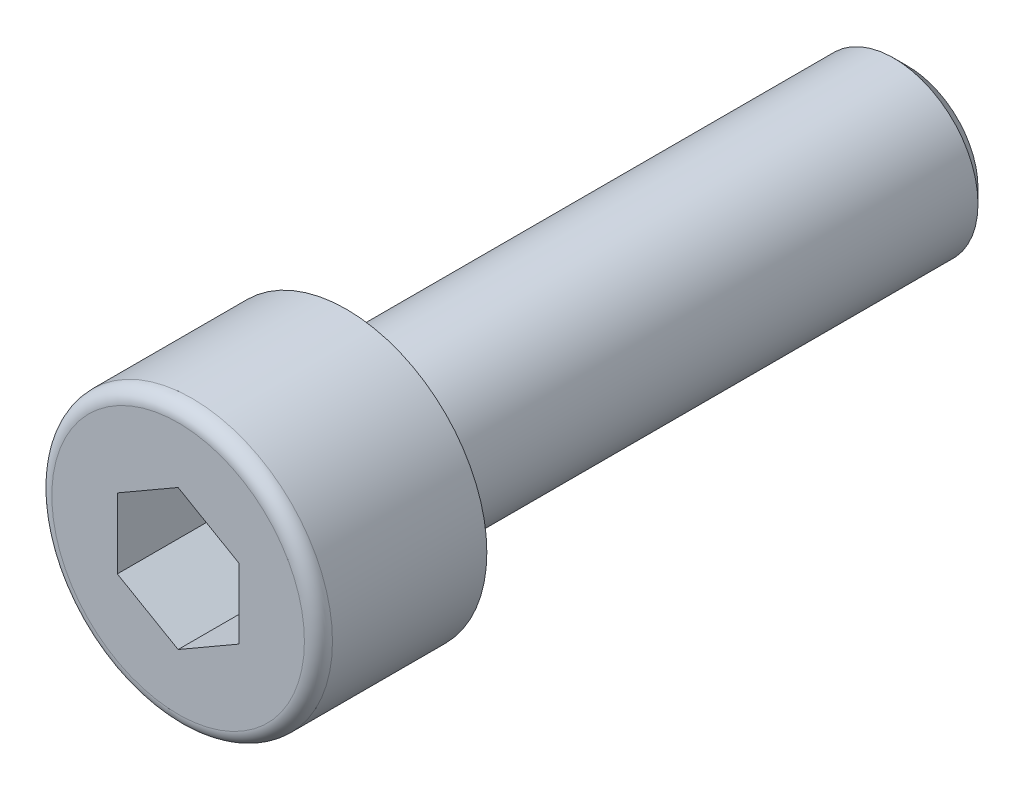
ISO-10303-21;
HEADER;
FILE_DESCRIPTION(('STEP AP214'),'2;1');
FILE_NAME('part.step','',(''),(''),'','','');
FILE_SCHEMA(('AUTOMOTIVE_DESIGN { 1 0 10303 214 1 1 1 1 }'));
ENDSEC;
DATA;
#1=APPLICATION_CONTEXT('core data for automotive mechanical design processes');
#2=APPLICATION_PROTOCOL_DEFINITION('international standard','automotive_design',2000,#1);
#3=PRODUCT_CONTEXT('',#1,'mechanical');
#4=PRODUCT('Part','Part','',(#3));
#5=PRODUCT_RELATED_PRODUCT_CATEGORY('part','',(#4));
#6=PRODUCT_DEFINITION_FORMATION('','',#4);
#7=PRODUCT_DEFINITION_CONTEXT('part definition',#1,'design');
#8=PRODUCT_DEFINITION('design','',#6,#7);
#9=PRODUCT_DEFINITION_SHAPE('','',#8);
#10=(LENGTH_UNIT() NAMED_UNIT(*) SI_UNIT(.MILLI.,.METRE.));
#11=(NAMED_UNIT(*) PLANE_ANGLE_UNIT() SI_UNIT($,.RADIAN.));
#12=(NAMED_UNIT(*) SI_UNIT($,.STERADIAN.) SOLID_ANGLE_UNIT());
#13=UNCERTAINTY_MEASURE_WITH_UNIT(LENGTH_MEASURE(1.E-05),#10,'distance_accuracy_value','');
#14=(GEOMETRIC_REPRESENTATION_CONTEXT(3) GLOBAL_UNCERTAINTY_ASSIGNED_CONTEXT((#13)) GLOBAL_UNIT_ASSIGNED_CONTEXT((#10,
#11,#12)) REPRESENTATION_CONTEXT('',''));
#15=CARTESIAN_POINT('',(0.,0.,0.));
#16=DIRECTION('',(0.,0.,1.));
#17=DIRECTION('',(1.,0.,0.));
#18=AXIS2_PLACEMENT_3D('',#15,#16,#17);
#19=CARTESIAN_POINT('',(0.,0.,20.));
#20=DIRECTION('',(0.,0.,-1.));
#21=DIRECTION('',(-1.,0.,0.));
#22=AXIS2_PLACEMENT_3D('',#19,#20,#21);
#23=CYLINDRICAL_SURFACE('',#22,3.);
#24=CARTESIAN_POINT('',(0.,0.,0.500000000000007));
#25=DIRECTION('',(0.,0.,1.));
#26=DIRECTION('',(1.,0.,0.));
#27=AXIS2_PLACEMENT_3D('',#24,#25,#26);
#28=CIRCLE('',#27,3.);
#29=CARTESIAN_POINT('',(3.,0.,0.500000000000007));
#30=VERTEX_POINT('',#29);
#31=EDGE_CURVE('E42',#30,#30,#28,.T.);
#32=ORIENTED_EDGE('',*,*,#31,.T.);
#33=EDGE_LOOP('',(#32));
#34=FACE_BOUND('',#33,.T.);
#35=CARTESIAN_POINT('',(0.,0.,20.));
#36=DIRECTION('',(0.,0.,1.));
#37=DIRECTION('',(1.,0.,0.));
#38=AXIS2_PLACEMENT_3D('',#35,#36,#37);
#39=CIRCLE('',#38,3.);
#40=CARTESIAN_POINT('',(3.,0.,20.));
#41=VERTEX_POINT('',#40);
#42=EDGE_CURVE('E145',#41,#41,#39,.T.);
#43=ORIENTED_EDGE('',*,*,#42,.F.);
#44=EDGE_LOOP('',(#43));
#45=FACE_BOUND('',#44,.T.);
#46=ADVANCED_FACE('F35',(#34,#45),#23,.T.);
#47=CARTESIAN_POINT('',(0.,0.,0.));
#48=DIRECTION('',(0.,0.,1.));
#49=DIRECTION('',(1.,0.,0.));
#50=AXIS2_PLACEMENT_3D('',#47,#48,#49);
#51=PLANE('',#50);
#52=CARTESIAN_POINT('',(0.,0.,0.));
#53=DIRECTION('',(0.,0.,1.));
#54=DIRECTION('',(1.,0.,0.));
#55=AXIS2_PLACEMENT_3D('',#52,#53,#54);
#56=CIRCLE('',#55,2.5);
#57=CARTESIAN_POINT('',(2.5,0.,0.));
#58=VERTEX_POINT('',#57);
#59=EDGE_CURVE('E11',#58,#58,#56,.F.);
#60=ORIENTED_EDGE('',*,*,#59,.T.);
#61=EDGE_LOOP('',(#60));
#62=FACE_BOUND('',#61,.T.);
#63=ADVANCED_FACE('F171',(#62),#51,.F.);
#64=CARTESIAN_POINT('',(0.,0.,20.));
#65=DIRECTION('',(0.,0.,1.));
#66=DIRECTION('',(1.,0.,0.));
#67=AXIS2_PLACEMENT_3D('',#64,#65,#66);
#68=PLANE('',#67);
#69=CARTESIAN_POINT('',(0.,0.,20.));
#70=DIRECTION('',(0.,0.,1.));
#71=DIRECTION('',(1.,0.,0.));
#72=AXIS2_PLACEMENT_3D('',#69,#70,#71);
#73=CIRCLE('',#72,5.);
#74=CARTESIAN_POINT('',(5.,0.,20.));
#75=VERTEX_POINT('',#74);
#76=EDGE_CURVE('E136',#75,#75,#73,.T.);
#77=ORIENTED_EDGE('',*,*,#76,.F.);
#78=EDGE_LOOP('',(#77));
#79=FACE_BOUND('',#78,.T.);
#80=ORIENTED_EDGE('',*,*,#42,.T.);
#81=EDGE_LOOP('',(#80));
#82=FACE_BOUND('',#81,.T.);
#83=ADVANCED_FACE('F175',(#79,#82),#68,.F.);
#84=CARTESIAN_POINT('',(0.,0.,26.));
#85=DIRECTION('',(0.,0.,-1.));
#86=DIRECTION('',(-1.,0.,0.));
#87=AXIS2_PLACEMENT_3D('',#84,#85,#86);
#88=CYLINDRICAL_SURFACE('',#87,5.);
#89=CARTESIAN_POINT('',(0.,0.,25.5));
#90=DIRECTION('',(0.,0.,1.));
#91=DIRECTION('',(1.,0.,0.));
#92=AXIS2_PLACEMENT_3D('',#89,#90,#91);
#93=CIRCLE('',#92,5.);
#94=CARTESIAN_POINT('',(5.,0.,25.5));
#95=VERTEX_POINT('',#94);
#96=EDGE_CURVE('E151',#95,#95,#93,.F.);
#97=ORIENTED_EDGE('',*,*,#96,.T.);
#98=EDGE_LOOP('',(#97));
#99=FACE_BOUND('',#98,.T.);
#100=ORIENTED_EDGE('',*,*,#76,.T.);
#101=EDGE_LOOP('',(#100));
#102=FACE_BOUND('',#101,.T.);
#103=ADVANCED_FACE('F180',(#99,#102),#88,.T.);
#104=CARTESIAN_POINT('',(0.,0.,26.));
#105=DIRECTION('',(0.,0.,1.));
#106=DIRECTION('',(1.,0.,0.));
#107=AXIS2_PLACEMENT_3D('',#104,#105,#106);
#108=PLANE('',#107);
#109=CARTESIAN_POINT('',(0.,0.,26.));
#110=DIRECTION('',(0.,0.,1.));
#111=DIRECTION('',(1.,0.,0.));
#112=AXIS2_PLACEMENT_3D('',#109,#110,#111);
#113=CIRCLE('',#112,4.5);
#114=CARTESIAN_POINT('',(4.5,0.,26.));
#115=VERTEX_POINT('',#114);
#116=EDGE_CURVE('E148',#115,#115,#113,.T.);
#117=ORIENTED_EDGE('',*,*,#116,.T.);
#118=EDGE_LOOP('',(#117));
#119=FACE_BOUND('',#118,.T.);
#120=DIRECTION('',(-0.866025403784439,0.5,0.));
#121=VECTOR('',#120,1.);
#122=CARTESIAN_POINT('',(2.1650635094611,1.25,26.));
#123=LINE('',#122,#121);
#124=CARTESIAN_POINT('',(2.1650635094611,1.25,26.));
#125=VERTEX_POINT('',#124);
#126=CARTESIAN_POINT('',(0.,2.5,26.));
#127=VERTEX_POINT('',#126);
#128=EDGE_CURVE('E49',#125,#127,#123,.T.);
#129=ORIENTED_EDGE('',*,*,#128,.F.);
#130=DIRECTION('',(0.,1.,0.));
#131=VECTOR('',#130,1.);
#132=CARTESIAN_POINT('',(2.1650635094611,-1.25,26.));
#133=LINE('',#132,#131);
#134=CARTESIAN_POINT('',(2.1650635094611,-1.25,26.));
#135=VERTEX_POINT('',#134);
#136=EDGE_CURVE('E118',#135,#125,#133,.T.);
#137=ORIENTED_EDGE('',*,*,#136,.F.);
#138=DIRECTION('',(0.866025403784439,0.5,0.));
#139=VECTOR('',#138,1.);
#140=CARTESIAN_POINT('',(0.,-2.5,26.));
#141=LINE('',#140,#139);
#142=CARTESIAN_POINT('',(0.,-2.5,26.));
#143=VERTEX_POINT('',#142);
#144=EDGE_CURVE('E112',#143,#135,#141,.T.);
#145=ORIENTED_EDGE('',*,*,#144,.F.);
#146=DIRECTION('',(0.866025403784439,-0.5,0.));
#147=VECTOR('',#146,1.);
#148=CARTESIAN_POINT('',(-2.1650635094611,-1.25,26.));
#149=LINE('',#148,#147);
#150=CARTESIAN_POINT('',(-2.1650635094611,-1.25,26.));
#151=VERTEX_POINT('',#150);
#152=EDGE_CURVE('E110',#151,#143,#149,.T.);
#153=ORIENTED_EDGE('',*,*,#152,.F.);
#154=DIRECTION('',(0.,-1.,0.));
#155=VECTOR('',#154,1.);
#156=CARTESIAN_POINT('',(-2.1650635094611,1.25,26.));
#157=LINE('',#156,#155);
#158=CARTESIAN_POINT('',(-2.1650635094611,1.25,26.));
#159=VERTEX_POINT('',#158);
#160=EDGE_CURVE('E92',#159,#151,#157,.T.);
#161=ORIENTED_EDGE('',*,*,#160,.F.);
#162=DIRECTION('',(-0.866025403784439,-0.5,0.));
#163=VECTOR('',#162,1.);
#164=CARTESIAN_POINT('',(0.,2.5,26.));
#165=LINE('',#164,#163);
#166=EDGE_CURVE('E103',#127,#159,#165,.T.);
#167=ORIENTED_EDGE('',*,*,#166,.F.);
#168=EDGE_LOOP('',(#129,#137,#145,#153,#161,#167));
#169=FACE_BOUND('',#168,.T.);
#170=ADVANCED_FACE('F107',(#119,#169),#108,.T.);
#171=CARTESIAN_POINT('',(2.1650635094611,1.25,22.5));
#172=DIRECTION('',(0.5,0.866025403784439,0.));
#173=DIRECTION('',(-0.866025403784439,0.5,0.));
#174=AXIS2_PLACEMENT_3D('',#171,#172,#173);
#175=PLANE('',#174);
#176=ORIENTED_EDGE('',*,*,#128,.T.);
#177=DIRECTION('',(0.,0.,1.));
#178=VECTOR('',#177,1.);
#179=CARTESIAN_POINT('',(0.,2.5,22.5));
#180=LINE('',#179,#178);
#181=CARTESIAN_POINT('',(0.,2.5,22.5));
#182=VERTEX_POINT('',#181);
#183=EDGE_CURVE('E100',#182,#127,#180,.T.);
#184=ORIENTED_EDGE('',*,*,#183,.F.);
#185=DIRECTION('',(-0.866025403784439,0.5,0.));
#186=VECTOR('',#185,1.);
#187=CARTESIAN_POINT('',(2.1650635094611,1.25,22.5));
#188=LINE('',#187,#186);
#189=CARTESIAN_POINT('',(2.1650635094611,1.25,22.5));
#190=VERTEX_POINT('',#189);
#191=EDGE_CURVE('E120',#190,#182,#188,.T.);
#192=ORIENTED_EDGE('',*,*,#191,.F.);
#193=DIRECTION('',(0.,0.,1.));
#194=VECTOR('',#193,1.);
#195=CARTESIAN_POINT('',(2.1650635094611,1.25,22.5));
#196=LINE('',#195,#194);
#197=EDGE_CURVE('E56',#190,#125,#196,.T.);
#198=ORIENTED_EDGE('',*,*,#197,.T.);
#199=EDGE_LOOP('',(#176,#184,#192,#198));
#200=FACE_BOUND('',#199,.T.);
#201=ADVANCED_FACE('F188',(#200),#175,.F.);
#202=CARTESIAN_POINT('',(2.1650635094611,-1.25,22.5));
#203=DIRECTION('',(1.,0.,0.));
#204=DIRECTION('',(0.,1.,0.));
#205=AXIS2_PLACEMENT_3D('',#202,#203,#204);
#206=PLANE('',#205);
#207=ORIENTED_EDGE('',*,*,#136,.T.);
#208=ORIENTED_EDGE('',*,*,#197,.F.);
#209=DIRECTION('',(0.,1.,0.));
#210=VECTOR('',#209,1.);
#211=CARTESIAN_POINT('',(2.1650635094611,-1.25,22.5));
#212=LINE('',#211,#210);
#213=CARTESIAN_POINT('',(2.1650635094611,-1.25,22.5));
#214=VERTEX_POINT('',#213);
#215=EDGE_CURVE('E132',#214,#190,#212,.T.);
#216=ORIENTED_EDGE('',*,*,#215,.F.);
#217=DIRECTION('',(0.,0.,1.));
#218=VECTOR('',#217,1.);
#219=CARTESIAN_POINT('',(2.1650635094611,-1.25,22.5));
#220=LINE('',#219,#218);
#221=EDGE_CURVE('E137',#214,#135,#220,.T.);
#222=ORIENTED_EDGE('',*,*,#221,.T.);
#223=EDGE_LOOP('',(#207,#208,#216,#222));
#224=FACE_BOUND('',#223,.T.);
#225=ADVANCED_FACE('F193',(#224),#206,.F.);
#226=CARTESIAN_POINT('',(0.,-2.5,22.5));
#227=DIRECTION('',(0.5,-0.866025403784439,0.));
#228=DIRECTION('',(0.866025403784439,0.5,0.));
#229=AXIS2_PLACEMENT_3D('',#226,#227,#228);
#230=PLANE('',#229);
#231=ORIENTED_EDGE('',*,*,#144,.T.);
#232=ORIENTED_EDGE('',*,*,#221,.F.);
#233=DIRECTION('',(0.866025403784439,0.5,0.));
#234=VECTOR('',#233,1.);
#235=CARTESIAN_POINT('',(0.,-2.5,22.5));
#236=LINE('',#235,#234);
#237=CARTESIAN_POINT('',(0.,-2.5,22.5));
#238=VERTEX_POINT('',#237);
#239=EDGE_CURVE('E129',#238,#214,#236,.T.);
#240=ORIENTED_EDGE('',*,*,#239,.F.);
#241=DIRECTION('',(0.,0.,1.));
#242=VECTOR('',#241,1.);
#243=CARTESIAN_POINT('',(0.,-2.5,22.5));
#244=LINE('',#243,#242);
#245=EDGE_CURVE('E139',#238,#143,#244,.T.);
#246=ORIENTED_EDGE('',*,*,#245,.T.);
#247=EDGE_LOOP('',(#231,#232,#240,#246));
#248=FACE_BOUND('',#247,.T.);
#249=ADVANCED_FACE('F201',(#248),#230,.F.);
#250=CARTESIAN_POINT('',(-2.1650635094611,-1.25,22.5));
#251=DIRECTION('',(-0.5,-0.866025403784439,0.));
#252=DIRECTION('',(0.866025403784439,-0.5,0.));
#253=AXIS2_PLACEMENT_3D('',#250,#251,#252);
#254=PLANE('',#253);
#255=ORIENTED_EDGE('',*,*,#152,.T.);
#256=ORIENTED_EDGE('',*,*,#245,.F.);
#257=DIRECTION('',(0.866025403784439,-0.5,0.));
#258=VECTOR('',#257,1.);
#259=CARTESIAN_POINT('',(-2.1650635094611,-1.25,22.5));
#260=LINE('',#259,#258);
#261=CARTESIAN_POINT('',(-2.1650635094611,-1.25,22.5));
#262=VERTEX_POINT('',#261);
#263=EDGE_CURVE('E126',#262,#238,#260,.T.);
#264=ORIENTED_EDGE('',*,*,#263,.F.);
#265=DIRECTION('',(0.,0.,1.));
#266=VECTOR('',#265,1.);
#267=CARTESIAN_POINT('',(-2.1650635094611,-1.25,22.5));
#268=LINE('',#267,#266);
#269=EDGE_CURVE('E99',#262,#151,#268,.T.);
#270=ORIENTED_EDGE('',*,*,#269,.T.);
#271=EDGE_LOOP('',(#255,#256,#264,#270));
#272=FACE_BOUND('',#271,.T.);
#273=ADVANCED_FACE('F198',(#272),#254,.F.);
#274=CARTESIAN_POINT('',(-2.1650635094611,1.25,22.5));
#275=DIRECTION('',(-1.,0.,0.));
#276=DIRECTION('',(0.,-1.,0.));
#277=AXIS2_PLACEMENT_3D('',#274,#275,#276);
#278=PLANE('',#277);
#279=ORIENTED_EDGE('',*,*,#160,.T.);
#280=ORIENTED_EDGE('',*,*,#269,.F.);
#281=DIRECTION('',(0.,-1.,0.));
#282=VECTOR('',#281,1.);
#283=CARTESIAN_POINT('',(-2.1650635094611,1.25,22.5));
#284=LINE('',#283,#282);
#285=CARTESIAN_POINT('',(-2.1650635094611,1.25,22.5));
#286=VERTEX_POINT('',#285);
#287=EDGE_CURVE('E95',#286,#262,#284,.T.);
#288=ORIENTED_EDGE('',*,*,#287,.F.);
#289=DIRECTION('',(0.,0.,1.));
#290=VECTOR('',#289,1.);
#291=CARTESIAN_POINT('',(-2.1650635094611,1.25,22.5));
#292=LINE('',#291,#290);
#293=EDGE_CURVE('E88',#286,#159,#292,.T.);
#294=ORIENTED_EDGE('',*,*,#293,.T.);
#295=EDGE_LOOP('',(#279,#280,#288,#294));
#296=FACE_BOUND('',#295,.T.);
#297=ADVANCED_FACE('F90',(#296),#278,.F.);
#298=CARTESIAN_POINT('',(0.,2.5,22.5));
#299=DIRECTION('',(-0.5,0.866025403784439,0.));
#300=DIRECTION('',(-0.866025403784439,-0.5,0.));
#301=AXIS2_PLACEMENT_3D('',#298,#299,#300);
#302=PLANE('',#301);
#303=ORIENTED_EDGE('',*,*,#166,.T.);
#304=ORIENTED_EDGE('',*,*,#293,.F.);
#305=DIRECTION('',(-0.866025403784439,-0.5,0.));
#306=VECTOR('',#305,1.);
#307=CARTESIAN_POINT('',(0.,2.5,22.5));
#308=LINE('',#307,#306);
#309=EDGE_CURVE('E123',#182,#286,#308,.T.);
#310=ORIENTED_EDGE('',*,*,#309,.F.);
#311=ORIENTED_EDGE('',*,*,#183,.T.);
#312=EDGE_LOOP('',(#303,#304,#310,#311));
#313=FACE_BOUND('',#312,.T.);
#314=ADVANCED_FACE('F104',(#313),#302,.F.);
#315=CARTESIAN_POINT('',(2.1650635094611,1.25,22.5));
#316=DIRECTION('',(0.,0.,-1.));
#317=DIRECTION('',(-1.,0.,0.));
#318=AXIS2_PLACEMENT_3D('',#315,#316,#317);
#319=PLANE('',#318);
#320=ORIENTED_EDGE('',*,*,#191,.T.);
#321=ORIENTED_EDGE('',*,*,#309,.T.);
#322=ORIENTED_EDGE('',*,*,#287,.T.);
#323=ORIENTED_EDGE('',*,*,#263,.T.);
#324=ORIENTED_EDGE('',*,*,#239,.T.);
#325=ORIENTED_EDGE('',*,*,#215,.T.);
#326=EDGE_LOOP('',(#320,#321,#322,#323,#324,#325));
#327=FACE_BOUND('',#326,.T.);
#328=ADVANCED_FACE('F166',(#327),#319,.F.);
#329=CARTESIAN_POINT('',(0.,0.,25.5));
#330=DIRECTION('',(0.,0.,1.));
#331=DIRECTION('',(1.,0.,0.));
#332=AXIS2_PLACEMENT_3D('',#329,#330,#331);
#333=TOROIDAL_SURFACE('',#332,4.5,0.5);
#334=ORIENTED_EDGE('',*,*,#96,.F.);
#335=EDGE_LOOP('',(#334));
#336=FACE_BOUND('',#335,.T.);
#337=ORIENTED_EDGE('',*,*,#116,.F.);
#338=EDGE_LOOP('',(#337));
#339=FACE_BOUND('',#338,.T.);
#340=ADVANCED_FACE('F160',(#336,#339),#333,.T.);
#341=CARTESIAN_POINT('',(0.,0.,0.500000000000007));
#342=DIRECTION('',(0.,0.,1.));
#343=DIRECTION('',(1.,0.,0.));
#344=AXIS2_PLACEMENT_3D('',#341,#342,#343);
#345=CONICAL_SURFACE('',#344,3.,0.785398163397445);
#346=ORIENTED_EDGE('',*,*,#59,.F.);
#347=EDGE_LOOP('',(#346));
#348=FACE_BOUND('',#347,.T.);
#349=ORIENTED_EDGE('',*,*,#31,.F.);
#350=EDGE_LOOP('',(#349));
#351=FACE_BOUND('',#350,.T.);
#352=ADVANCED_FACE('F158',(#348,#351),#345,.T.);
#353=CLOSED_SHELL('',(#46,#63,#83,#103,#170,#201,#225,#249,#273,#297,#314,#328,#340,#352));
#354=MANIFOLD_SOLID_BREP('B2',#353);
#355=ADVANCED_BREP_SHAPE_REPRESENTATION('',(#18,#354),#14);
#356=SHAPE_DEFINITION_REPRESENTATION(#9,#355);
ENDSEC;
END-ISO-10303-21;
